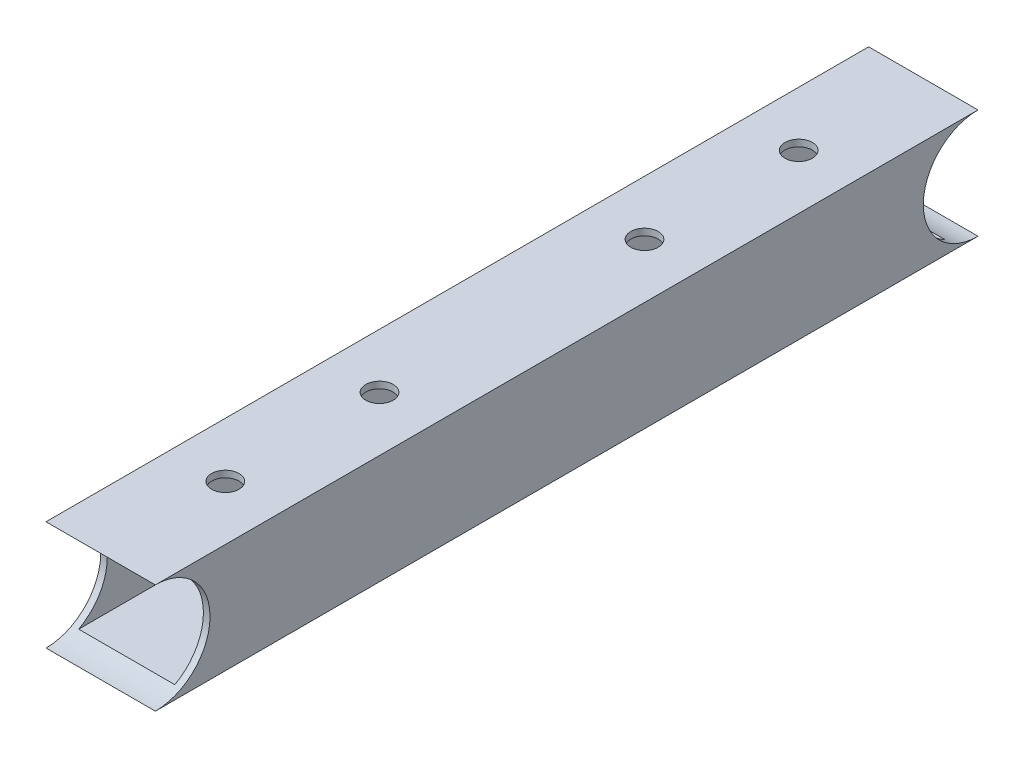
ISO-10303-21;
HEADER;
FILE_DESCRIPTION(('STEP AP214'),'2;1');
FILE_NAME('part.step','',(''),(''),'','','');
FILE_SCHEMA(('AUTOMOTIVE_DESIGN { 1 0 10303 214 1 1 1 1 }'));
ENDSEC;
DATA;
#1=APPLICATION_CONTEXT('core data for automotive mechanical design processes');
#2=APPLICATION_PROTOCOL_DEFINITION('international standard','automotive_design',2000,#1);
#3=PRODUCT_CONTEXT('',#1,'mechanical');
#4=PRODUCT('Part','Part','',(#3));
#5=PRODUCT_RELATED_PRODUCT_CATEGORY('part','',(#4));
#6=PRODUCT_DEFINITION_FORMATION('','',#4);
#7=PRODUCT_DEFINITION_CONTEXT('part definition',#1,'design');
#8=PRODUCT_DEFINITION('design','',#6,#7);
#9=PRODUCT_DEFINITION_SHAPE('','',#8);
#10=(LENGTH_UNIT() NAMED_UNIT(*) SI_UNIT(.MILLI.,.METRE.));
#11=(NAMED_UNIT(*) PLANE_ANGLE_UNIT() SI_UNIT($,.RADIAN.));
#12=(NAMED_UNIT(*) SI_UNIT($,.STERADIAN.) SOLID_ANGLE_UNIT());
#13=UNCERTAINTY_MEASURE_WITH_UNIT(LENGTH_MEASURE(1.E-05),#10,'distance_accuracy_value','');
#14=(GEOMETRIC_REPRESENTATION_CONTEXT(3) GLOBAL_UNCERTAINTY_ASSIGNED_CONTEXT((#13)) GLOBAL_UNIT_ASSIGNED_CONTEXT((#10,
#11,#12)) REPRESENTATION_CONTEXT('',''));
#15=CARTESIAN_POINT('',(0.,0.,0.));
#16=DIRECTION('',(0.,0.,1.));
#17=DIRECTION('',(1.,0.,0.));
#18=AXIS2_PLACEMENT_3D('',#15,#16,#17);
#19=CARTESIAN_POINT('',(-17.526,-17.526,300.));
#20=DIRECTION('',(0.,1.,0.));
#21=DIRECTION('',(0.,0.,1.));
#22=AXIS2_PLACEMENT_3D('',#19,#20,#21);
#23=PLANE('',#22);
#24=CARTESIAN_POINT('',(0.,-17.526,45.455));
#25=DIRECTION('',(0.,1.,0.));
#26=DIRECTION('',(0.,0.,1.));
#27=AXIS2_PLACEMENT_3D('',#24,#25,#26);
#28=CIRCLE('',#27,5.);
#29=CARTESIAN_POINT('',(0.,-17.526,50.455));
#30=VERTEX_POINT('',#29);
#31=EDGE_CURVE('E124',#30,#30,#28,.T.);
#32=ORIENTED_EDGE('',*,*,#31,.F.);
#33=EDGE_LOOP('',(#32));
#34=FACE_BOUND('',#33,.T.);
#35=CARTESIAN_POINT('',(0.,-17.526,101.685));
#36=DIRECTION('',(0.,1.,0.));
#37=DIRECTION('',(0.,0.,1.));
#38=AXIS2_PLACEMENT_3D('',#35,#36,#37);
#39=CIRCLE('',#38,5.);
#40=CARTESIAN_POINT('',(0.,-17.526,106.685));
#41=VERTEX_POINT('',#40);
#42=EDGE_CURVE('E162',#41,#41,#39,.T.);
#43=ORIENTED_EDGE('',*,*,#42,.F.);
#44=EDGE_LOOP('',(#43));
#45=FACE_BOUND('',#44,.T.);
#46=CARTESIAN_POINT('',(0.,-17.526,254.545));
#47=DIRECTION('',(0.,1.,0.));
#48=DIRECTION('',(0.,0.,1.));
#49=AXIS2_PLACEMENT_3D('',#46,#47,#48);
#50=CIRCLE('',#49,5.);
#51=CARTESIAN_POINT('',(0.,-17.526,259.545));
#52=VERTEX_POINT('',#51);
#53=EDGE_CURVE('E154',#52,#52,#50,.T.);
#54=ORIENTED_EDGE('',*,*,#53,.F.);
#55=EDGE_LOOP('',(#54));
#56=FACE_BOUND('',#55,.T.);
#57=CARTESIAN_POINT('',(0.,-17.526,198.315));
#58=DIRECTION('',(0.,1.,0.));
#59=DIRECTION('',(0.,0.,1.));
#60=AXIS2_PLACEMENT_3D('',#57,#58,#59);
#61=CIRCLE('',#60,5.);
#62=CARTESIAN_POINT('',(0.,-17.526,203.315));
#63=VERTEX_POINT('',#62);
#64=EDGE_CURVE('E149',#63,#63,#61,.T.);
#65=ORIENTED_EDGE('',*,*,#64,.F.);
#66=EDGE_LOOP('',(#65));
#67=FACE_BOUND('',#66,.T.);
#68=DIRECTION('',(1.,0.,0.));
#69=VECTOR('',#68,1.);
#70=CARTESIAN_POINT('',(-280.061,-17.526,290.491948412004));
#71=LINE('',#70,#69);
#72=CARTESIAN_POINT('',(17.526,-17.526,290.491948412004));
#73=VERTEX_POINT('',#72);
#74=CARTESIAN_POINT('',(-17.526,-17.526,290.491948412004));
#75=VERTEX_POINT('',#74);
#76=EDGE_CURVE('E11',#73,#75,#71,.F.);
#77=ORIENTED_EDGE('',*,*,#76,.F.);
#78=DIRECTION('',(0.,0.,-1.));
#79=VECTOR('',#78,1.);
#80=CARTESIAN_POINT('',(17.526,-17.526,300.));
#81=LINE('',#80,#79);
#82=CARTESIAN_POINT('',(17.526,-17.526,9.50805158799641));
#83=VERTEX_POINT('',#82);
#84=EDGE_CURVE('E198',#73,#83,#81,.T.);
#85=ORIENTED_EDGE('',*,*,#84,.T.);
#86=DIRECTION('',(1.,0.,0.));
#87=VECTOR('',#86,1.);
#88=CARTESIAN_POINT('',(-280.061,-17.526,9.50805158799641));
#89=LINE('',#88,#87);
#90=CARTESIAN_POINT('',(-17.526,-17.526,9.50805158799639));
#91=VERTEX_POINT('',#90);
#92=EDGE_CURVE('E46',#91,#83,#89,.T.);
#93=ORIENTED_EDGE('',*,*,#92,.F.);
#94=DIRECTION('',(0.,0.,-1.));
#95=VECTOR('',#94,1.);
#96=CARTESIAN_POINT('',(-17.526,-17.526,300.));
#97=LINE('',#96,#95);
#98=EDGE_CURVE('E201',#75,#91,#97,.T.);
#99=ORIENTED_EDGE('',*,*,#98,.F.);
#100=EDGE_LOOP('',(#77,#85,#93,#99));
#101=FACE_BOUND('',#100,.T.);
#102=ADVANCED_FACE('F37',(#34,#45,#56,#67,#101),#23,.T.);
#103=CARTESIAN_POINT('',(-17.526,17.526,300.));
#104=DIRECTION('',(1.,0.,0.));
#105=DIRECTION('',(0.,0.,-1.));
#106=AXIS2_PLACEMENT_3D('',#103,#104,#105);
#107=PLANE('',#106);
#108=CARTESIAN_POINT('',(-17.526,0.,300.));
#109=DIRECTION('',(1.,0.,0.));
#110=DIRECTION('',(0.,0.,-1.));
#111=AXIS2_PLACEMENT_3D('',#108,#109,#110);
#112=CIRCLE('',#111,19.939);
#113=CARTESIAN_POINT('',(-17.526,17.526,290.491948412004));
#114=VERTEX_POINT('',#113);
#115=EDGE_CURVE('E190',#75,#114,#112,.T.);
#116=ORIENTED_EDGE('',*,*,#115,.F.);
#117=ORIENTED_EDGE('',*,*,#98,.T.);
#118=CARTESIAN_POINT('',(-17.526,0.,0.));
#119=DIRECTION('',(1.,0.,0.));
#120=DIRECTION('',(0.,0.,-1.));
#121=AXIS2_PLACEMENT_3D('',#118,#119,#120);
#122=CIRCLE('',#121,19.939);
#123=CARTESIAN_POINT('',(-17.526,17.526,9.50805158799635));
#124=VERTEX_POINT('',#123);
#125=EDGE_CURVE('E61',#124,#91,#122,.T.);
#126=ORIENTED_EDGE('',*,*,#125,.F.);
#127=DIRECTION('',(0.,0.,-1.));
#128=VECTOR('',#127,1.);
#129=CARTESIAN_POINT('',(-17.526,17.526,300.));
#130=LINE('',#129,#128);
#131=EDGE_CURVE('E204',#114,#124,#130,.T.);
#132=ORIENTED_EDGE('',*,*,#131,.F.);
#133=EDGE_LOOP('',(#116,#117,#126,#132));
#134=FACE_BOUND('',#133,.T.);
#135=ADVANCED_FACE('F233',(#134),#107,.T.);
#136=CARTESIAN_POINT('',(-17.526,17.526,300.));
#137=DIRECTION('',(0.,-1.,0.));
#138=DIRECTION('',(0.,0.,-1.));
#139=AXIS2_PLACEMENT_3D('',#136,#137,#138);
#140=PLANE('',#139);
#141=CARTESIAN_POINT('',(0.,17.526,45.455));
#142=DIRECTION('',(0.,-1.,0.));
#143=DIRECTION('',(0.,0.,-1.));
#144=AXIS2_PLACEMENT_3D('',#141,#142,#143);
#145=CIRCLE('',#144,5.);
#146=CARTESIAN_POINT('',(0.,17.526,40.455));
#147=VERTEX_POINT('',#146);
#148=EDGE_CURVE('E177',#147,#147,#145,.T.);
#149=ORIENTED_EDGE('',*,*,#148,.F.);
#150=EDGE_LOOP('',(#149));
#151=FACE_BOUND('',#150,.T.);
#152=CARTESIAN_POINT('',(0.,17.526,101.685));
#153=DIRECTION('',(0.,-1.,0.));
#154=DIRECTION('',(0.,0.,-1.));
#155=AXIS2_PLACEMENT_3D('',#152,#153,#154);
#156=CIRCLE('',#155,5.);
#157=CARTESIAN_POINT('',(0.,17.526,96.685));
#158=VERTEX_POINT('',#157);
#159=EDGE_CURVE('E153',#158,#158,#156,.T.);
#160=ORIENTED_EDGE('',*,*,#159,.F.);
#161=EDGE_LOOP('',(#160));
#162=FACE_BOUND('',#161,.T.);
#163=CARTESIAN_POINT('',(0.,17.526,254.545));
#164=DIRECTION('',(0.,-1.,0.));
#165=DIRECTION('',(0.,0.,-1.));
#166=AXIS2_PLACEMENT_3D('',#163,#164,#165);
#167=CIRCLE('',#166,5.);
#168=CARTESIAN_POINT('',(0.,17.526,249.545));
#169=VERTEX_POINT('',#168);
#170=EDGE_CURVE('E148',#169,#169,#167,.T.);
#171=ORIENTED_EDGE('',*,*,#170,.F.);
#172=EDGE_LOOP('',(#171));
#173=FACE_BOUND('',#172,.T.);
#174=CARTESIAN_POINT('',(0.,17.526,198.315));
#175=DIRECTION('',(0.,-1.,0.));
#176=DIRECTION('',(0.,0.,-1.));
#177=AXIS2_PLACEMENT_3D('',#174,#175,#176);
#178=CIRCLE('',#177,5.);
#179=CARTESIAN_POINT('',(0.,17.526,193.315));
#180=VERTEX_POINT('',#179);
#181=EDGE_CURVE('E143',#180,#180,#178,.T.);
#182=ORIENTED_EDGE('',*,*,#181,.F.);
#183=EDGE_LOOP('',(#182));
#184=FACE_BOUND('',#183,.T.);
#185=DIRECTION('',(1.,0.,0.));
#186=VECTOR('',#185,1.);
#187=CARTESIAN_POINT('',(-280.061,17.526,290.491948412004));
#188=LINE('',#187,#186);
#189=CARTESIAN_POINT('',(17.526,17.526,290.491948412004));
#190=VERTEX_POINT('',#189);
#191=EDGE_CURVE('E192',#114,#190,#188,.T.);
#192=ORIENTED_EDGE('',*,*,#191,.F.);
#193=ORIENTED_EDGE('',*,*,#131,.T.);
#194=DIRECTION('',(1.,0.,0.));
#195=VECTOR('',#194,1.);
#196=CARTESIAN_POINT('',(-280.061,17.526,9.50805158799631));
#197=LINE('',#196,#195);
#198=CARTESIAN_POINT('',(17.526,17.526,9.50805158799631));
#199=VERTEX_POINT('',#198);
#200=EDGE_CURVE('E185',#199,#124,#197,.F.);
#201=ORIENTED_EDGE('',*,*,#200,.F.);
#202=DIRECTION('',(0.,0.,-1.));
#203=VECTOR('',#202,1.);
#204=CARTESIAN_POINT('',(17.526,17.526,300.));
#205=LINE('',#204,#203);
#206=EDGE_CURVE('E114',#190,#199,#205,.T.);
#207=ORIENTED_EDGE('',*,*,#206,.F.);
#208=EDGE_LOOP('',(#192,#193,#201,#207));
#209=FACE_BOUND('',#208,.T.);
#210=ADVANCED_FACE('F239',(#151,#162,#173,#184,#209),#140,.T.);
#211=CARTESIAN_POINT('',(17.526,17.526,300.));
#212=DIRECTION('',(-1.,0.,0.));
#213=DIRECTION('',(0.,0.,1.));
#214=AXIS2_PLACEMENT_3D('',#211,#212,#213);
#215=PLANE('',#214);
#216=CARTESIAN_POINT('',(17.526,0.,300.));
#217=DIRECTION('',(-1.,0.,0.));
#218=DIRECTION('',(0.,0.,1.));
#219=AXIS2_PLACEMENT_3D('',#216,#217,#218);
#220=CIRCLE('',#219,19.939);
#221=EDGE_CURVE('E53',#190,#73,#220,.T.);
#222=ORIENTED_EDGE('',*,*,#221,.F.);
#223=ORIENTED_EDGE('',*,*,#206,.T.);
#224=CARTESIAN_POINT('',(17.526,0.,0.));
#225=DIRECTION('',(-1.,0.,0.));
#226=DIRECTION('',(0.,0.,1.));
#227=AXIS2_PLACEMENT_3D('',#224,#225,#226);
#228=CIRCLE('',#227,19.939);
#229=EDGE_CURVE('E187',#83,#199,#228,.T.);
#230=ORIENTED_EDGE('',*,*,#229,.F.);
#231=ORIENTED_EDGE('',*,*,#84,.F.);
#232=EDGE_LOOP('',(#222,#223,#230,#231));
#233=FACE_BOUND('',#232,.T.);
#234=ADVANCED_FACE('F229',(#233),#215,.T.);
#235=CARTESIAN_POINT('',(-280.061,0.,0.));
#236=DIRECTION('',(1.,0.,0.));
#237=DIRECTION('',(0.,1.,0.));
#238=AXIS2_PLACEMENT_3D('',#235,#236,#237);
#239=CYLINDRICAL_SURFACE('',#238,19.939);
#240=DIRECTION('',(-1.,0.,0.));
#241=VECTOR('',#240,1.);
#242=CARTESIAN_POINT('',(-19.939,19.939,0.));
#243=LINE('',#242,#241);
#244=CARTESIAN_POINT('',(19.939,19.939,0.));
#245=VERTEX_POINT('',#244);
#246=CARTESIAN_POINT('',(-19.939,19.939,0.));
#247=VERTEX_POINT('',#246);
#248=EDGE_CURVE('E102',#245,#247,#243,.T.);
#249=ORIENTED_EDGE('',*,*,#248,.F.);
#250=CARTESIAN_POINT('',(19.939,0.,0.));
#251=DIRECTION('',(1.,0.,0.));
#252=DIRECTION('',(0.,1.,0.));
#253=AXIS2_PLACEMENT_3D('',#250,#251,#252);
#254=CIRCLE('',#253,19.939);
#255=CARTESIAN_POINT('',(19.939,-19.939,0.));
#256=VERTEX_POINT('',#255);
#257=EDGE_CURVE('E105',#245,#256,#254,.T.);
#258=ORIENTED_EDGE('',*,*,#257,.T.);
#259=DIRECTION('',(1.,0.,0.));
#260=VECTOR('',#259,1.);
#261=CARTESIAN_POINT('',(-19.939,-19.939,0.));
#262=LINE('',#261,#260);
#263=CARTESIAN_POINT('',(-19.939,-19.939,0.));
#264=VERTEX_POINT('',#263);
#265=EDGE_CURVE('E113',#264,#256,#262,.T.);
#266=ORIENTED_EDGE('',*,*,#265,.F.);
#267=CARTESIAN_POINT('',(-19.939,0.,0.));
#268=DIRECTION('',(1.,0.,0.));
#269=DIRECTION('',(0.,1.,0.));
#270=AXIS2_PLACEMENT_3D('',#267,#268,#269);
#271=CIRCLE('',#270,19.939);
#272=EDGE_CURVE('E108',#247,#264,#271,.T.);
#273=ORIENTED_EDGE('',*,*,#272,.F.);
#274=EDGE_LOOP('',(#249,#258,#266,#273));
#275=FACE_BOUND('',#274,.T.);
#276=ORIENTED_EDGE('',*,*,#229,.T.);
#277=ORIENTED_EDGE('',*,*,#200,.T.);
#278=ORIENTED_EDGE('',*,*,#125,.T.);
#279=ORIENTED_EDGE('',*,*,#92,.T.);
#280=EDGE_LOOP('',(#276,#277,#278,#279));
#281=FACE_BOUND('',#280,.T.);
#282=ADVANCED_FACE('F104',(#275,#281),#239,.F.);
#283=CARTESIAN_POINT('',(-280.061,0.,300.));
#284=DIRECTION('',(1.,0.,0.));
#285=DIRECTION('',(0.,1.,0.));
#286=AXIS2_PLACEMENT_3D('',#283,#284,#285);
#287=CYLINDRICAL_SURFACE('',#286,19.939);
#288=ORIENTED_EDGE('',*,*,#221,.T.);
#289=ORIENTED_EDGE('',*,*,#76,.T.);
#290=ORIENTED_EDGE('',*,*,#115,.T.);
#291=ORIENTED_EDGE('',*,*,#191,.T.);
#292=EDGE_LOOP('',(#288,#289,#290,#291));
#293=FACE_BOUND('',#292,.T.);
#294=CARTESIAN_POINT('',(-19.939,0.,300.));
#295=DIRECTION('',(1.,0.,0.));
#296=DIRECTION('',(0.,1.,0.));
#297=AXIS2_PLACEMENT_3D('',#294,#295,#296);
#298=CIRCLE('',#297,19.939);
#299=CARTESIAN_POINT('',(-19.939,-19.939,300.));
#300=VERTEX_POINT('',#299);
#301=CARTESIAN_POINT('',(-19.939,19.939,300.));
#302=VERTEX_POINT('',#301);
#303=EDGE_CURVE('E195',#300,#302,#298,.T.);
#304=ORIENTED_EDGE('',*,*,#303,.F.);
#305=DIRECTION('',(1.,0.,0.));
#306=VECTOR('',#305,1.);
#307=CARTESIAN_POINT('',(-19.939,-19.939,300.));
#308=LINE('',#307,#306);
#309=CARTESIAN_POINT('',(19.939,-19.939,300.));
#310=VERTEX_POINT('',#309);
#311=EDGE_CURVE('E211',#300,#310,#308,.T.);
#312=ORIENTED_EDGE('',*,*,#311,.T.);
#313=CARTESIAN_POINT('',(19.939,0.,300.));
#314=DIRECTION('',(1.,0.,0.));
#315=DIRECTION('',(0.,1.,0.));
#316=AXIS2_PLACEMENT_3D('',#313,#314,#315);
#317=CIRCLE('',#316,19.939);
#318=CARTESIAN_POINT('',(19.939,19.939,300.));
#319=VERTEX_POINT('',#318);
#320=EDGE_CURVE('E123',#310,#319,#317,.T.);
#321=ORIENTED_EDGE('',*,*,#320,.T.);
#322=DIRECTION('',(-1.,0.,0.));
#323=VECTOR('',#322,1.);
#324=CARTESIAN_POINT('',(-19.939,19.939,300.));
#325=LINE('',#324,#323);
#326=EDGE_CURVE('E128',#319,#302,#325,.T.);
#327=ORIENTED_EDGE('',*,*,#326,.T.);
#328=EDGE_LOOP('',(#304,#312,#321,#327));
#329=FACE_BOUND('',#328,.T.);
#330=ADVANCED_FACE('F222',(#293,#329),#287,.F.);
#331=CARTESIAN_POINT('',(19.939,19.939,300.));
#332=DIRECTION('',(-1.,0.,0.));
#333=DIRECTION('',(0.,-1.,0.));
#334=AXIS2_PLACEMENT_3D('',#331,#332,#333);
#335=PLANE('',#334);
#336=DIRECTION('',(0.,0.,-1.));
#337=VECTOR('',#336,1.);
#338=CARTESIAN_POINT('',(19.939,19.939,300.));
#339=LINE('',#338,#337);
#340=EDGE_CURVE('E120',#319,#245,#339,.T.);
#341=ORIENTED_EDGE('',*,*,#340,.F.);
#342=ORIENTED_EDGE('',*,*,#320,.F.);
#343=DIRECTION('',(0.,0.,-1.));
#344=VECTOR('',#343,1.);
#345=CARTESIAN_POINT('',(19.939,-19.939,300.));
#346=LINE('',#345,#344);
#347=EDGE_CURVE('E122',#310,#256,#346,.T.);
#348=ORIENTED_EDGE('',*,*,#347,.T.);
#349=ORIENTED_EDGE('',*,*,#257,.F.);
#350=EDGE_LOOP('',(#341,#342,#348,#349));
#351=FACE_BOUND('',#350,.T.);
#352=ADVANCED_FACE('F39',(#351),#335,.F.);
#353=CARTESIAN_POINT('',(-19.939,19.939,300.));
#354=DIRECTION('',(0.,-1.,0.));
#355=DIRECTION('',(0.,0.,-1.));
#356=AXIS2_PLACEMENT_3D('',#353,#354,#355);
#357=PLANE('',#356);
#358=CARTESIAN_POINT('',(0.,19.939,45.455));
#359=DIRECTION('',(0.,1.,0.));
#360=DIRECTION('',(0.,0.,-1.));
#361=AXIS2_PLACEMENT_3D('',#358,#359,#360);
#362=CIRCLE('',#361,5.);
#363=CARTESIAN_POINT('',(0.,19.939,40.455));
#364=VERTEX_POINT('',#363);
#365=EDGE_CURVE('E263',#364,#364,#362,.T.);
#366=ORIENTED_EDGE('',*,*,#365,.F.);
#367=EDGE_LOOP('',(#366));
#368=FACE_BOUND('',#367,.T.);
#369=CARTESIAN_POINT('',(0.,19.939,101.685));
#370=DIRECTION('',(0.,1.,0.));
#371=DIRECTION('',(0.,0.,-1.));
#372=AXIS2_PLACEMENT_3D('',#369,#370,#371);
#373=CIRCLE('',#372,5.);
#374=CARTESIAN_POINT('',(0.,19.939,96.685));
#375=VERTEX_POINT('',#374);
#376=EDGE_CURVE('E267',#375,#375,#373,.T.);
#377=ORIENTED_EDGE('',*,*,#376,.F.);
#378=EDGE_LOOP('',(#377));
#379=FACE_BOUND('',#378,.T.);
#380=CARTESIAN_POINT('',(0.,19.939,254.545));
#381=DIRECTION('',(0.,1.,0.));
#382=DIRECTION('',(0.,0.,1.));
#383=AXIS2_PLACEMENT_3D('',#380,#381,#382);
#384=CIRCLE('',#383,5.);
#385=CARTESIAN_POINT('',(0.,19.939,259.545));
#386=VERTEX_POINT('',#385);
#387=EDGE_CURVE('E271',#386,#386,#384,.T.);
#388=ORIENTED_EDGE('',*,*,#387,.F.);
#389=EDGE_LOOP('',(#388));
#390=FACE_BOUND('',#389,.T.);
#391=CARTESIAN_POINT('',(0.,19.939,198.315));
#392=DIRECTION('',(0.,1.,0.));
#393=DIRECTION('',(0.,0.,1.));
#394=AXIS2_PLACEMENT_3D('',#391,#392,#393);
#395=CIRCLE('',#394,5.);
#396=CARTESIAN_POINT('',(0.,19.939,203.315));
#397=VERTEX_POINT('',#396);
#398=EDGE_CURVE('E144',#397,#397,#395,.T.);
#399=ORIENTED_EDGE('',*,*,#398,.F.);
#400=EDGE_LOOP('',(#399));
#401=FACE_BOUND('',#400,.T.);
#402=ORIENTED_EDGE('',*,*,#248,.T.);
#403=DIRECTION('',(0.,0.,-1.));
#404=VECTOR('',#403,1.);
#405=CARTESIAN_POINT('',(-19.939,19.939,300.));
#406=LINE('',#405,#404);
#407=EDGE_CURVE('E130',#302,#247,#406,.T.);
#408=ORIENTED_EDGE('',*,*,#407,.F.);
#409=ORIENTED_EDGE('',*,*,#326,.F.);
#410=ORIENTED_EDGE('',*,*,#340,.T.);
#411=EDGE_LOOP('',(#402,#408,#409,#410));
#412=FACE_BOUND('',#411,.T.);
#413=ADVANCED_FACE('F127',(#368,#379,#390,#401,#412),#357,.F.);
#414=CARTESIAN_POINT('',(-19.939,19.939,300.));
#415=DIRECTION('',(1.,0.,0.));
#416=DIRECTION('',(0.,1.,0.));
#417=AXIS2_PLACEMENT_3D('',#414,#415,#416);
#418=PLANE('',#417);
#419=DIRECTION('',(0.,0.,-1.));
#420=VECTOR('',#419,1.);
#421=CARTESIAN_POINT('',(-19.939,-19.939,300.));
#422=LINE('',#421,#420);
#423=EDGE_CURVE('E136',#300,#264,#422,.T.);
#424=ORIENTED_EDGE('',*,*,#423,.F.);
#425=ORIENTED_EDGE('',*,*,#303,.T.);
#426=ORIENTED_EDGE('',*,*,#407,.T.);
#427=ORIENTED_EDGE('',*,*,#272,.T.);
#428=EDGE_LOOP('',(#424,#425,#426,#427));
#429=FACE_BOUND('',#428,.T.);
#430=ADVANCED_FACE('F220',(#429),#418,.F.);
#431=CARTESIAN_POINT('',(-19.939,-19.939,300.));
#432=DIRECTION('',(0.,1.,0.));
#433=DIRECTION('',(0.,0.,1.));
#434=AXIS2_PLACEMENT_3D('',#431,#432,#433);
#435=PLANE('',#434);
#436=CARTESIAN_POINT('',(0.,-19.939,45.455));
#437=DIRECTION('',(0.,1.,0.));
#438=DIRECTION('',(0.,0.,1.));
#439=AXIS2_PLACEMENT_3D('',#436,#437,#438);
#440=CIRCLE('',#439,5.);
#441=CARTESIAN_POINT('',(0.,-19.939,50.455));
#442=VERTEX_POINT('',#441);
#443=EDGE_CURVE('E41',#442,#442,#440,.T.);
#444=ORIENTED_EDGE('',*,*,#443,.T.);
#445=EDGE_LOOP('',(#444));
#446=FACE_BOUND('',#445,.T.);
#447=CARTESIAN_POINT('',(0.,-19.939,101.685));
#448=DIRECTION('',(0.,1.,0.));
#449=DIRECTION('',(0.,0.,1.));
#450=AXIS2_PLACEMENT_3D('',#447,#448,#449);
#451=CIRCLE('',#450,5.);
#452=CARTESIAN_POINT('',(0.,-19.939,106.685));
#453=VERTEX_POINT('',#452);
#454=EDGE_CURVE('E150',#453,#453,#451,.T.);
#455=ORIENTED_EDGE('',*,*,#454,.T.);
#456=EDGE_LOOP('',(#455));
#457=FACE_BOUND('',#456,.T.);
#458=CARTESIAN_POINT('',(0.,-19.939,254.545));
#459=DIRECTION('',(0.,1.,0.));
#460=DIRECTION('',(0.,0.,1.));
#461=AXIS2_PLACEMENT_3D('',#458,#459,#460);
#462=CIRCLE('',#461,5.);
#463=CARTESIAN_POINT('',(0.,-19.939,259.545));
#464=VERTEX_POINT('',#463);
#465=EDGE_CURVE('E145',#464,#464,#462,.T.);
#466=ORIENTED_EDGE('',*,*,#465,.T.);
#467=EDGE_LOOP('',(#466));
#468=FACE_BOUND('',#467,.T.);
#469=CARTESIAN_POINT('',(0.,-19.939,198.315));
#470=DIRECTION('',(0.,1.,0.));
#471=DIRECTION('',(0.,0.,1.));
#472=AXIS2_PLACEMENT_3D('',#469,#470,#471);
#473=CIRCLE('',#472,5.);
#474=CARTESIAN_POINT('',(0.,-19.939,203.315));
#475=VERTEX_POINT('',#474);
#476=EDGE_CURVE('E140',#475,#475,#473,.T.);
#477=ORIENTED_EDGE('',*,*,#476,.T.);
#478=EDGE_LOOP('',(#477));
#479=FACE_BOUND('',#478,.T.);
#480=ORIENTED_EDGE('',*,*,#265,.T.);
#481=ORIENTED_EDGE('',*,*,#347,.F.);
#482=ORIENTED_EDGE('',*,*,#311,.F.);
#483=ORIENTED_EDGE('',*,*,#423,.T.);
#484=EDGE_LOOP('',(#480,#481,#482,#483));
#485=FACE_BOUND('',#484,.T.);
#486=ADVANCED_FACE('F218',(#446,#457,#468,#479,#485),#435,.F.);
#487=CARTESIAN_POINT('',(0.,-75.061,198.315));
#488=DIRECTION('',(0.,1.,0.));
#489=DIRECTION('',(0.,0.,1.));
#490=AXIS2_PLACEMENT_3D('',#487,#488,#489);
#491=CYLINDRICAL_SURFACE('',#490,5.);
#492=ORIENTED_EDGE('',*,*,#64,.T.);
#493=EDGE_LOOP('',(#492));
#494=FACE_BOUND('',#493,.T.);
#495=ORIENTED_EDGE('',*,*,#476,.F.);
#496=EDGE_LOOP('',(#495));
#497=FACE_BOUND('',#496,.T.);
#498=ADVANCED_FACE('F253',(#494,#497),#491,.F.);
#499=CARTESIAN_POINT('',(0.,-75.061,254.545));
#500=DIRECTION('',(0.,1.,0.));
#501=DIRECTION('',(0.,0.,1.));
#502=AXIS2_PLACEMENT_3D('',#499,#500,#501);
#503=CYLINDRICAL_SURFACE('',#502,5.);
#504=ORIENTED_EDGE('',*,*,#53,.T.);
#505=EDGE_LOOP('',(#504));
#506=FACE_BOUND('',#505,.T.);
#507=ORIENTED_EDGE('',*,*,#465,.F.);
#508=EDGE_LOOP('',(#507));
#509=FACE_BOUND('',#508,.T.);
#510=ADVANCED_FACE('F299',(#506,#509),#503,.F.);
#511=CARTESIAN_POINT('',(0.,-75.061,101.685));
#512=DIRECTION('',(0.,1.,0.));
#513=DIRECTION('',(0.,0.,1.));
#514=AXIS2_PLACEMENT_3D('',#511,#512,#513);
#515=CYLINDRICAL_SURFACE('',#514,5.);
#516=ORIENTED_EDGE('',*,*,#42,.T.);
#517=EDGE_LOOP('',(#516));
#518=FACE_BOUND('',#517,.T.);
#519=ORIENTED_EDGE('',*,*,#454,.F.);
#520=EDGE_LOOP('',(#519));
#521=FACE_BOUND('',#520,.T.);
#522=ADVANCED_FACE('F306',(#518,#521),#515,.F.);
#523=CARTESIAN_POINT('',(0.,-75.061,45.455));
#524=DIRECTION('',(0.,1.,0.));
#525=DIRECTION('',(0.,0.,1.));
#526=AXIS2_PLACEMENT_3D('',#523,#524,#525);
#527=CYLINDRICAL_SURFACE('',#526,5.);
#528=ORIENTED_EDGE('',*,*,#31,.T.);
#529=EDGE_LOOP('',(#528));
#530=FACE_BOUND('',#529,.T.);
#531=ORIENTED_EDGE('',*,*,#443,.F.);
#532=EDGE_LOOP('',(#531));
#533=FACE_BOUND('',#532,.T.);
#534=ADVANCED_FACE('F311',(#530,#533),#527,.F.);
#535=ORIENTED_EDGE('',*,*,#181,.T.);
#536=EDGE_LOOP('',(#535));
#537=FACE_BOUND('',#536,.T.);
#538=ORIENTED_EDGE('',*,*,#398,.T.);
#539=EDGE_LOOP('',(#538));
#540=FACE_BOUND('',#539,.T.);
#541=ADVANCED_FACE('F300',(#537,#540),#491,.F.);
#542=ORIENTED_EDGE('',*,*,#170,.T.);
#543=EDGE_LOOP('',(#542));
#544=FACE_BOUND('',#543,.T.);
#545=ORIENTED_EDGE('',*,*,#387,.T.);
#546=EDGE_LOOP('',(#545));
#547=FACE_BOUND('',#546,.T.);
#548=ADVANCED_FACE('F308',(#544,#547),#503,.F.);
#549=ORIENTED_EDGE('',*,*,#159,.T.);
#550=EDGE_LOOP('',(#549));
#551=FACE_BOUND('',#550,.T.);
#552=ORIENTED_EDGE('',*,*,#376,.T.);
#553=EDGE_LOOP('',(#552));
#554=FACE_BOUND('',#553,.T.);
#555=ADVANCED_FACE('F317',(#551,#554),#515,.F.);
#556=ORIENTED_EDGE('',*,*,#148,.T.);
#557=EDGE_LOOP('',(#556));
#558=FACE_BOUND('',#557,.T.);
#559=ORIENTED_EDGE('',*,*,#365,.T.);
#560=EDGE_LOOP('',(#559));
#561=FACE_BOUND('',#560,.T.);
#562=ADVANCED_FACE('F320',(#558,#561),#527,.F.);
#563=CLOSED_SHELL('',(#102,#135,#210,#234,#282,#330,#352,#413,#430,#486,#498,#510,#522,#534,
#541,#548,#555,#562));
#564=MANIFOLD_SOLID_BREP('B2',#563);
#565=ADVANCED_BREP_SHAPE_REPRESENTATION('',(#18,#564),#14);
#566=SHAPE_DEFINITION_REPRESENTATION(#9,#565);
ENDSEC;
END-ISO-10303-21;
